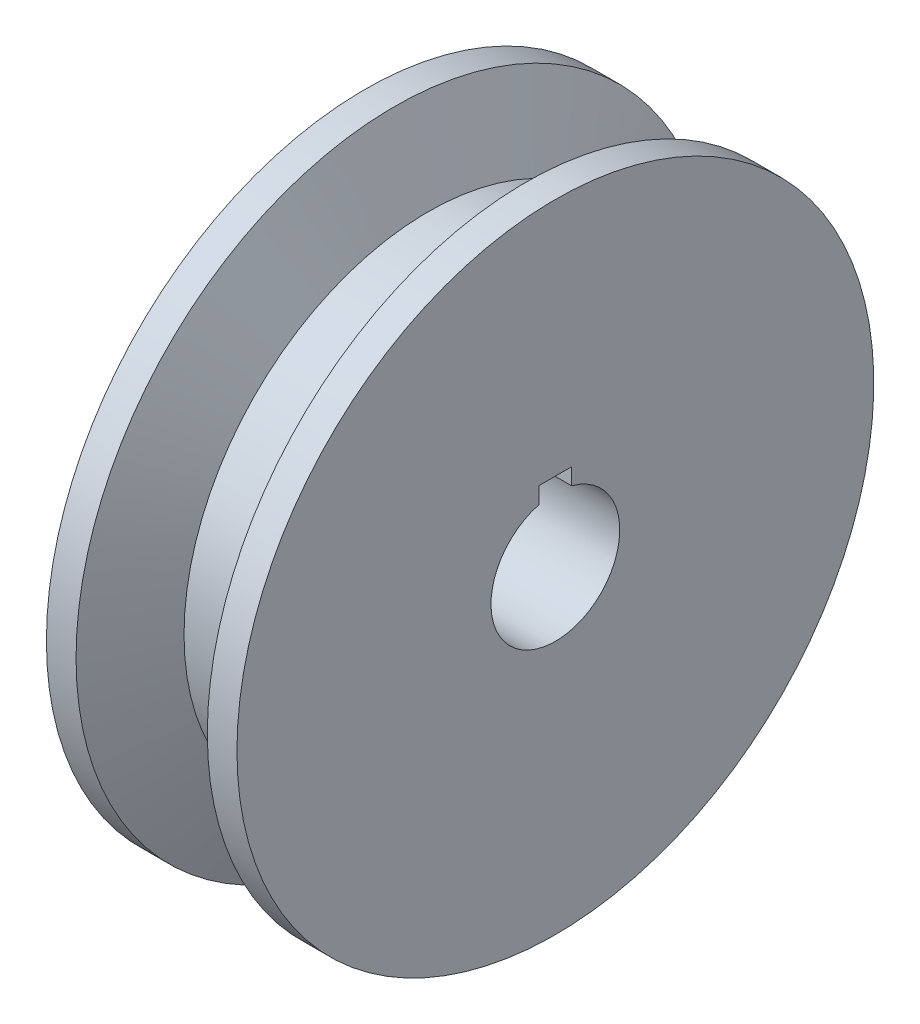
ISO-10303-21;
HEADER;
FILE_DESCRIPTION(('STEP AP214'),'2;1');
FILE_NAME('part.step','',(''),(''),'','','');
FILE_SCHEMA(('AUTOMOTIVE_DESIGN { 1 0 10303 214 1 1 1 1 }'));
ENDSEC;
DATA;
#1=APPLICATION_CONTEXT('core data for automotive mechanical design processes');
#2=APPLICATION_PROTOCOL_DEFINITION('international standard','automotive_design',2000,#1);
#3=PRODUCT_CONTEXT('',#1,'mechanical');
#4=PRODUCT('Part','Part','',(#3));
#5=PRODUCT_RELATED_PRODUCT_CATEGORY('part','',(#4));
#6=PRODUCT_DEFINITION_FORMATION('','',#4);
#7=PRODUCT_DEFINITION_CONTEXT('part definition',#1,'design');
#8=PRODUCT_DEFINITION('design','',#6,#7);
#9=PRODUCT_DEFINITION_SHAPE('','',#8);
#10=(LENGTH_UNIT() NAMED_UNIT(*) SI_UNIT(.MILLI.,.METRE.));
#11=(NAMED_UNIT(*) PLANE_ANGLE_UNIT() SI_UNIT($,.RADIAN.));
#12=(NAMED_UNIT(*) SI_UNIT($,.STERADIAN.) SOLID_ANGLE_UNIT());
#13=UNCERTAINTY_MEASURE_WITH_UNIT(LENGTH_MEASURE(1.E-05),#10,'distance_accuracy_value','');
#14=(GEOMETRIC_REPRESENTATION_CONTEXT(3) GLOBAL_UNCERTAINTY_ASSIGNED_CONTEXT((#13)) GLOBAL_UNIT_ASSIGNED_CONTEXT((#10,
#11,#12)) REPRESENTATION_CONTEXT('',''));
#15=CARTESIAN_POINT('',(0.,0.,0.));
#16=DIRECTION('',(0.,0.,1.));
#17=DIRECTION('',(1.,0.,0.));
#18=AXIS2_PLACEMENT_3D('',#15,#16,#17);
#19=CARTESIAN_POINT('',(31.75,47.752,0.));
#20=DIRECTION('',(-1.,0.,0.));
#21=DIRECTION('',(0.,0.,1.));
#22=AXIS2_PLACEMENT_3D('',#19,#20,#21);
#23=PLANE('',#22);
#24=CARTESIAN_POINT('',(31.75,0.,0.));
#25=DIRECTION('',(-1.,0.,0.));
#26=DIRECTION('',(0.,0.,1.));
#27=AXIS2_PLACEMENT_3D('',#24,#25,#26);
#28=CIRCLE('',#27,47.752);
#29=CARTESIAN_POINT('',(31.75,0.,47.752));
#30=VERTEX_POINT('',#29);
#31=EDGE_CURVE('E101',#30,#30,#28,.T.);
#32=ORIENTED_EDGE('',*,*,#31,.F.);
#33=EDGE_LOOP('',(#32));
#34=FACE_BOUND('',#33,.T.);
#35=DIRECTION('',(0.,0.,1.));
#36=VECTOR('',#35,1.);
#37=CARTESIAN_POINT('',(31.75,11.811,-2.4384));
#38=LINE('',#37,#36);
#39=CARTESIAN_POINT('',(31.75,11.811,-2.4384));
#40=VERTEX_POINT('',#39);
#41=CARTESIAN_POINT('',(31.75,11.811,2.4384));
#42=VERTEX_POINT('',#41);
#43=EDGE_CURVE('E111',#40,#42,#38,.T.);
#44=ORIENTED_EDGE('',*,*,#43,.F.);
#45=DIRECTION('',(0.,1.,0.));
#46=VECTOR('',#45,1.);
#47=CARTESIAN_POINT('',(31.75,9.338913718415,-2.4384));
#48=LINE('',#47,#46);
#49=CARTESIAN_POINT('',(31.75,9.338913718415,-2.4384));
#50=VERTEX_POINT('',#49);
#51=EDGE_CURVE('E110',#50,#40,#48,.T.);
#52=ORIENTED_EDGE('',*,*,#51,.F.);
#53=CARTESIAN_POINT('',(31.75,0.,0.));
#54=DIRECTION('',(-1.,0.,0.));
#55=DIRECTION('',(0.,0.,1.));
#56=AXIS2_PLACEMENT_3D('',#53,#54,#55);
#57=CIRCLE('',#56,9.652);
#58=CARTESIAN_POINT('',(31.75,9.33891371841501,2.4384));
#59=VERTEX_POINT('',#58);
#60=EDGE_CURVE('E13',#50,#59,#57,.T.);
#61=ORIENTED_EDGE('',*,*,#60,.T.);
#62=DIRECTION('',(0.,-1.,0.));
#63=VECTOR('',#62,1.);
#64=CARTESIAN_POINT('',(31.75,11.811,2.4384));
#65=LINE('',#64,#63);
#66=EDGE_CURVE('E95',#42,#59,#65,.T.);
#67=ORIENTED_EDGE('',*,*,#66,.F.);
#68=EDGE_LOOP('',(#44,#52,#61,#67));
#69=FACE_BOUND('',#68,.T.);
#70=ADVANCED_FACE('F55',(#34,#69),#23,.F.);
#71=CARTESIAN_POINT('',(0.,0.,0.));
#72=DIRECTION('',(-1.,0.,0.));
#73=DIRECTION('',(0.,0.,1.));
#74=AXIS2_PLACEMENT_3D('',#71,#72,#73);
#75=CYLINDRICAL_SURFACE('',#74,9.652);
#76=ORIENTED_EDGE('',*,*,#60,.F.);
#77=DIRECTION('',(-1.,0.,0.));
#78=VECTOR('',#77,1.);
#79=CARTESIAN_POINT('',(31.751,9.338913718415,-2.4384));
#80=LINE('',#79,#78);
#81=CARTESIAN_POINT('',(0.,9.338913718415,-2.4384));
#82=VERTEX_POINT('',#81);
#83=EDGE_CURVE('E77',#50,#82,#80,.T.);
#84=ORIENTED_EDGE('',*,*,#83,.T.);
#85=CARTESIAN_POINT('',(0.,0.,0.));
#86=DIRECTION('',(-1.,0.,0.));
#87=DIRECTION('',(0.,0.,1.));
#88=AXIS2_PLACEMENT_3D('',#85,#86,#87);
#89=CIRCLE('',#88,9.652);
#90=CARTESIAN_POINT('',(0.,9.338913718415,2.4384));
#91=VERTEX_POINT('',#90);
#92=EDGE_CURVE('E62',#82,#91,#89,.T.);
#93=ORIENTED_EDGE('',*,*,#92,.T.);
#94=DIRECTION('',(-1.,0.,0.));
#95=VECTOR('',#94,1.);
#96=CARTESIAN_POINT('',(31.751,9.338913718415,2.4384));
#97=LINE('',#96,#95);
#98=EDGE_CURVE('E69',#59,#91,#97,.T.);
#99=ORIENTED_EDGE('',*,*,#98,.F.);
#100=EDGE_LOOP('',(#76,#84,#93,#99));
#101=FACE_BOUND('',#100,.T.);
#102=ADVANCED_FACE('F106',(#101),#75,.F.);
#103=CARTESIAN_POINT('',(0.,9.652,0.));
#104=DIRECTION('',(1.,0.,0.));
#105=DIRECTION('',(0.,0.,-1.));
#106=AXIS2_PLACEMENT_3D('',#103,#104,#105);
#107=PLANE('',#106);
#108=ORIENTED_EDGE('',*,*,#92,.F.);
#109=DIRECTION('',(0.,-1.,0.));
#110=VECTOR('',#109,1.);
#111=CARTESIAN_POINT('',(0.,9.338913718415,-2.4384));
#112=LINE('',#111,#110);
#113=CARTESIAN_POINT('',(0.,11.811,-2.4384));
#114=VERTEX_POINT('',#113);
#115=EDGE_CURVE('E108',#114,#82,#112,.T.);
#116=ORIENTED_EDGE('',*,*,#115,.F.);
#117=DIRECTION('',(0.,0.,-1.));
#118=VECTOR('',#117,1.);
#119=CARTESIAN_POINT('',(0.,11.811,-2.4384));
#120=LINE('',#119,#118);
#121=CARTESIAN_POINT('',(0.,11.811,2.4384));
#122=VERTEX_POINT('',#121);
#123=EDGE_CURVE('E114',#122,#114,#120,.T.);
#124=ORIENTED_EDGE('',*,*,#123,.F.);
#125=DIRECTION('',(0.,1.,0.));
#126=VECTOR('',#125,1.);
#127=CARTESIAN_POINT('',(0.,11.811,2.4384));
#128=LINE('',#127,#126);
#129=EDGE_CURVE('E112',#91,#122,#128,.T.);
#130=ORIENTED_EDGE('',*,*,#129,.F.);
#131=EDGE_LOOP('',(#108,#116,#124,#130));
#132=FACE_BOUND('',#131,.T.);
#133=CARTESIAN_POINT('',(0.,0.,0.));
#134=DIRECTION('',(-1.,0.,0.));
#135=DIRECTION('',(0.,0.,1.));
#136=AXIS2_PLACEMENT_3D('',#133,#134,#135);
#137=CIRCLE('',#136,15.875);
#138=CARTESIAN_POINT('',(0.,0.,15.875));
#139=VERTEX_POINT('',#138);
#140=EDGE_CURVE('E145',#139,#139,#137,.T.);
#141=ORIENTED_EDGE('',*,*,#140,.T.);
#142=EDGE_LOOP('',(#141));
#143=FACE_BOUND('',#142,.T.);
#144=ADVANCED_FACE('F149',(#132,#143),#107,.F.);
#145=CARTESIAN_POINT('',(0.,0.,0.));
#146=DIRECTION('',(-1.,0.,0.));
#147=DIRECTION('',(0.,0.,1.));
#148=AXIS2_PLACEMENT_3D('',#145,#146,#147);
#149=CYLINDRICAL_SURFACE('',#148,15.875);
#150=ORIENTED_EDGE('',*,*,#140,.F.);
#151=EDGE_LOOP('',(#150));
#152=FACE_BOUND('',#151,.T.);
#153=CARTESIAN_POINT('',(3.175,0.,0.));
#154=DIRECTION('',(-1.,0.,0.));
#155=DIRECTION('',(0.,0.,1.));
#156=AXIS2_PLACEMENT_3D('',#153,#154,#155);
#157=CIRCLE('',#156,15.875);
#158=CARTESIAN_POINT('',(3.175,0.,15.875));
#159=VERTEX_POINT('',#158);
#160=EDGE_CURVE('E142',#159,#159,#157,.T.);
#161=ORIENTED_EDGE('',*,*,#160,.T.);
#162=EDGE_LOOP('',(#161));
#163=FACE_BOUND('',#162,.T.);
#164=ADVANCED_FACE('F151',(#152,#163),#149,.T.);
#165=CARTESIAN_POINT('',(3.175,15.875,0.));
#166=DIRECTION('',(1.,0.,0.));
#167=DIRECTION('',(0.,0.,-1.));
#168=AXIS2_PLACEMENT_3D('',#165,#166,#167);
#169=PLANE('',#168);
#170=ORIENTED_EDGE('',*,*,#160,.F.);
#171=EDGE_LOOP('',(#170));
#172=FACE_BOUND('',#171,.T.);
#173=CARTESIAN_POINT('',(3.175,0.,0.));
#174=DIRECTION('',(-1.,0.,0.));
#175=DIRECTION('',(0.,0.,1.));
#176=AXIS2_PLACEMENT_3D('',#173,#174,#175);
#177=CIRCLE('',#176,47.752);
#178=CARTESIAN_POINT('',(3.175,0.,47.752));
#179=VERTEX_POINT('',#178);
#180=EDGE_CURVE('E139',#179,#179,#177,.T.);
#181=ORIENTED_EDGE('',*,*,#180,.T.);
#182=EDGE_LOOP('',(#181));
#183=FACE_BOUND('',#182,.T.);
#184=ADVANCED_FACE('F154',(#172,#183),#169,.F.);
#185=CARTESIAN_POINT('',(0.,0.,0.));
#186=DIRECTION('',(-1.,0.,0.));
#187=DIRECTION('',(0.,0.,1.));
#188=AXIS2_PLACEMENT_3D('',#185,#186,#187);
#189=CYLINDRICAL_SURFACE('',#188,47.752);
#190=ORIENTED_EDGE('',*,*,#180,.F.);
#191=EDGE_LOOP('',(#190));
#192=FACE_BOUND('',#191,.T.);
#193=CARTESIAN_POINT('',(7.62,0.,0.));
#194=DIRECTION('',(-1.,0.,0.));
#195=DIRECTION('',(0.,0.,1.));
#196=AXIS2_PLACEMENT_3D('',#193,#194,#195);
#197=CIRCLE('',#196,47.752);
#198=CARTESIAN_POINT('',(7.62,0.,47.752));
#199=VERTEX_POINT('',#198);
#200=EDGE_CURVE('E136',#199,#199,#197,.T.);
#201=ORIENTED_EDGE('',*,*,#200,.T.);
#202=EDGE_LOOP('',(#201));
#203=FACE_BOUND('',#202,.T.);
#204=ADVANCED_FACE('F160',(#192,#203),#189,.T.);
#205=CARTESIAN_POINT('',(12.7,0.,0.));
#206=DIRECTION('',(-1.,0.,0.));
#207=DIRECTION('',(0.,0.,1.));
#208=AXIS2_PLACEMENT_3D('',#205,#206,#207);
#209=CONICAL_SURFACE('',#208,36.6395,1.14201829934888);
#210=ORIENTED_EDGE('',*,*,#200,.F.);
#211=EDGE_LOOP('',(#210));
#212=FACE_BOUND('',#211,.T.);
#213=CARTESIAN_POINT('',(12.7,0.,0.));
#214=DIRECTION('',(-1.,0.,0.));
#215=DIRECTION('',(0.,0.,1.));
#216=AXIS2_PLACEMENT_3D('',#213,#214,#215);
#217=CIRCLE('',#216,36.6395);
#218=CARTESIAN_POINT('',(12.7,0.,36.6395));
#219=VERTEX_POINT('',#218);
#220=EDGE_CURVE('E133',#219,#219,#217,.T.);
#221=ORIENTED_EDGE('',*,*,#220,.T.);
#222=EDGE_LOOP('',(#221));
#223=FACE_BOUND('',#222,.T.);
#224=ADVANCED_FACE('F166',(#212,#223),#209,.T.);
#225=CARTESIAN_POINT('',(0.,0.,0.));
#226=DIRECTION('',(-1.,0.,0.));
#227=DIRECTION('',(0.,0.,1.));
#228=AXIS2_PLACEMENT_3D('',#225,#226,#227);
#229=CYLINDRICAL_SURFACE('',#228,36.6395);
#230=ORIENTED_EDGE('',*,*,#220,.F.);
#231=EDGE_LOOP('',(#230));
#232=FACE_BOUND('',#231,.T.);
#233=CARTESIAN_POINT('',(22.225,0.,0.));
#234=DIRECTION('',(-1.,0.,0.));
#235=DIRECTION('',(0.,0.,1.));
#236=AXIS2_PLACEMENT_3D('',#233,#234,#235);
#237=CIRCLE('',#236,36.6395);
#238=CARTESIAN_POINT('',(22.225,0.,36.6395));
#239=VERTEX_POINT('',#238);
#240=EDGE_CURVE('E130',#239,#239,#237,.T.);
#241=ORIENTED_EDGE('',*,*,#240,.T.);
#242=EDGE_LOOP('',(#241));
#243=FACE_BOUND('',#242,.T.);
#244=ADVANCED_FACE('F172',(#232,#243),#229,.T.);
#245=CARTESIAN_POINT('',(27.305,0.,0.));
#246=DIRECTION('',(1.,0.,0.));
#247=DIRECTION('',(0.,0.,-1.));
#248=AXIS2_PLACEMENT_3D('',#245,#246,#247);
#249=CONICAL_SURFACE('',#248,47.752,1.14201829934888);
#250=ORIENTED_EDGE('',*,*,#240,.F.);
#251=EDGE_LOOP('',(#250));
#252=FACE_BOUND('',#251,.T.);
#253=CARTESIAN_POINT('',(27.305,0.,0.));
#254=DIRECTION('',(-1.,0.,0.));
#255=DIRECTION('',(0.,0.,1.));
#256=AXIS2_PLACEMENT_3D('',#253,#254,#255);
#257=CIRCLE('',#256,47.752);
#258=CARTESIAN_POINT('',(27.305,0.,47.752));
#259=VERTEX_POINT('',#258);
#260=EDGE_CURVE('E127',#259,#259,#257,.T.);
#261=ORIENTED_EDGE('',*,*,#260,.T.);
#262=EDGE_LOOP('',(#261));
#263=FACE_BOUND('',#262,.T.);
#264=ADVANCED_FACE('F178',(#252,#263),#249,.T.);
#265=CARTESIAN_POINT('',(0.,0.,0.));
#266=DIRECTION('',(-1.,0.,0.));
#267=DIRECTION('',(0.,0.,1.));
#268=AXIS2_PLACEMENT_3D('',#265,#266,#267);
#269=CYLINDRICAL_SURFACE('',#268,47.752);
#270=ORIENTED_EDGE('',*,*,#260,.F.);
#271=EDGE_LOOP('',(#270));
#272=FACE_BOUND('',#271,.T.);
#273=ORIENTED_EDGE('',*,*,#31,.T.);
#274=EDGE_LOOP('',(#273));
#275=FACE_BOUND('',#274,.T.);
#276=ADVANCED_FACE('F184',(#272,#275),#269,.T.);
#277=CARTESIAN_POINT('',(31.751,9.338913718415,-2.4384));
#278=DIRECTION('',(0.,0.,-1.));
#279=DIRECTION('',(0.,1.,0.));
#280=AXIS2_PLACEMENT_3D('',#277,#278,#279);
#281=PLANE('',#280);
#282=ORIENTED_EDGE('',*,*,#51,.T.);
#283=DIRECTION('',(-1.,0.,0.));
#284=VECTOR('',#283,1.);
#285=CARTESIAN_POINT('',(31.751,11.811,-2.4384));
#286=LINE('',#285,#284);
#287=EDGE_CURVE('E122',#40,#114,#286,.T.);
#288=ORIENTED_EDGE('',*,*,#287,.T.);
#289=ORIENTED_EDGE('',*,*,#115,.T.);
#290=ORIENTED_EDGE('',*,*,#83,.F.);
#291=EDGE_LOOP('',(#282,#288,#289,#290));
#292=FACE_BOUND('',#291,.T.);
#293=ADVANCED_FACE('F190',(#292),#281,.F.);
#294=CARTESIAN_POINT('',(31.751,11.811,-2.4384));
#295=DIRECTION('',(0.,1.,0.));
#296=DIRECTION('',(0.,0.,1.));
#297=AXIS2_PLACEMENT_3D('',#294,#295,#296);
#298=PLANE('',#297);
#299=ORIENTED_EDGE('',*,*,#43,.T.);
#300=DIRECTION('',(-1.,0.,0.));
#301=VECTOR('',#300,1.);
#302=CARTESIAN_POINT('',(31.751,11.811,2.4384));
#303=LINE('',#302,#301);
#304=EDGE_CURVE('E97',#42,#122,#303,.T.);
#305=ORIENTED_EDGE('',*,*,#304,.T.);
#306=ORIENTED_EDGE('',*,*,#123,.T.);
#307=ORIENTED_EDGE('',*,*,#287,.F.);
#308=EDGE_LOOP('',(#299,#305,#306,#307));
#309=FACE_BOUND('',#308,.T.);
#310=ADVANCED_FACE('F206',(#309),#298,.F.);
#311=CARTESIAN_POINT('',(31.751,11.811,2.4384));
#312=DIRECTION('',(0.,0.,1.));
#313=DIRECTION('',(0.,-1.,0.));
#314=AXIS2_PLACEMENT_3D('',#311,#312,#313);
#315=PLANE('',#314);
#316=ORIENTED_EDGE('',*,*,#66,.T.);
#317=ORIENTED_EDGE('',*,*,#98,.T.);
#318=ORIENTED_EDGE('',*,*,#129,.T.);
#319=ORIENTED_EDGE('',*,*,#304,.F.);
#320=EDGE_LOOP('',(#316,#317,#318,#319));
#321=FACE_BOUND('',#320,.T.);
#322=ADVANCED_FACE('F96',(#321),#315,.F.);
#323=CLOSED_SHELL('',(#70,#102,#144,#164,#184,#204,#224,#244,#264,#276,#293,#310,#322));
#324=MANIFOLD_SOLID_BREP('B2',#323);
#325=ADVANCED_BREP_SHAPE_REPRESENTATION('',(#18,#324),#14);
#326=SHAPE_DEFINITION_REPRESENTATION(#9,#325);
ENDSEC;
END-ISO-10303-21;
